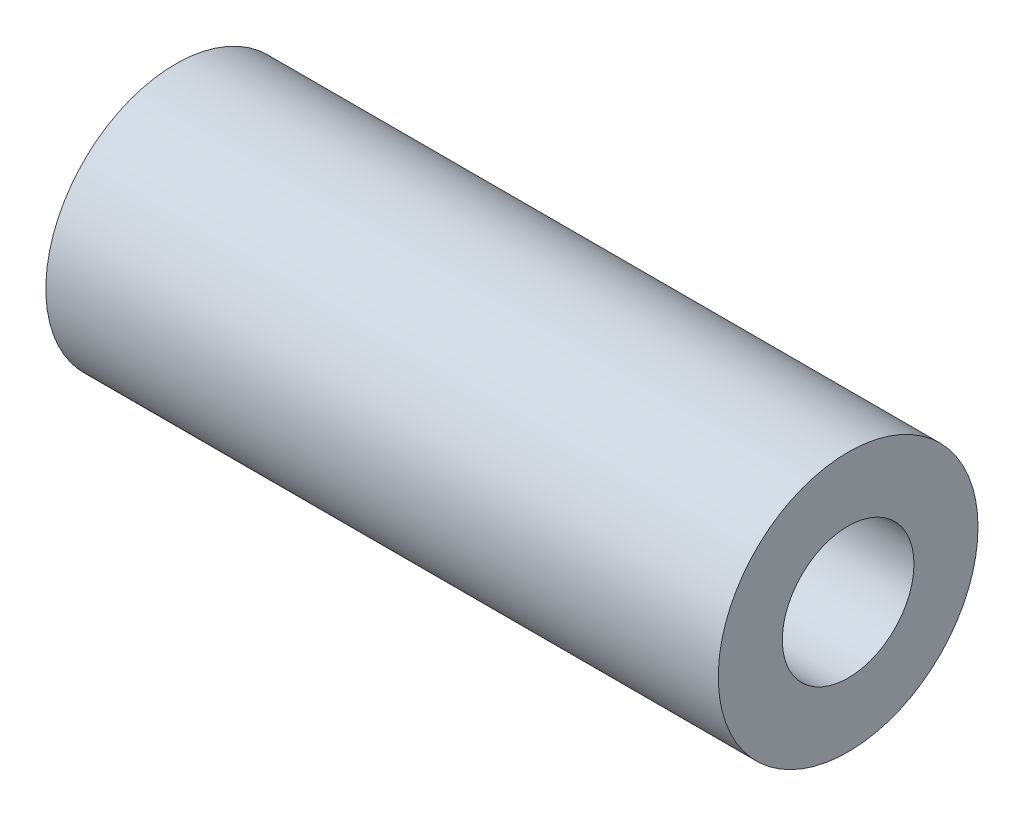
ISO-10303-21;
HEADER;
FILE_DESCRIPTION(('STEP AP214'),'2;1');
FILE_NAME('part.step','',(''),(''),'','','');
FILE_SCHEMA(('AUTOMOTIVE_DESIGN { 1 0 10303 214 1 1 1 1 }'));
ENDSEC;
DATA;
#1=APPLICATION_CONTEXT('core data for automotive mechanical design processes');
#2=APPLICATION_PROTOCOL_DEFINITION('international standard','automotive_design',2000,#1);
#3=PRODUCT_CONTEXT('',#1,'mechanical');
#4=PRODUCT('Part','Part','',(#3));
#5=PRODUCT_RELATED_PRODUCT_CATEGORY('part','',(#4));
#6=PRODUCT_DEFINITION_FORMATION('','',#4);
#7=PRODUCT_DEFINITION_CONTEXT('part definition',#1,'design');
#8=PRODUCT_DEFINITION('design','',#6,#7);
#9=PRODUCT_DEFINITION_SHAPE('','',#8);
#10=(LENGTH_UNIT() NAMED_UNIT(*) SI_UNIT(.MILLI.,.METRE.));
#11=(NAMED_UNIT(*) PLANE_ANGLE_UNIT() SI_UNIT($,.RADIAN.));
#12=(NAMED_UNIT(*) SI_UNIT($,.STERADIAN.) SOLID_ANGLE_UNIT());
#13=UNCERTAINTY_MEASURE_WITH_UNIT(LENGTH_MEASURE(1.E-05),#10,'distance_accuracy_value','');
#14=(GEOMETRIC_REPRESENTATION_CONTEXT(3) GLOBAL_UNCERTAINTY_ASSIGNED_CONTEXT((#13)) GLOBAL_UNIT_ASSIGNED_CONTEXT((#10,
#11,#12)) REPRESENTATION_CONTEXT('',''));
#15=CARTESIAN_POINT('',(0.,0.,0.));
#16=DIRECTION('',(0.,0.,1.));
#17=DIRECTION('',(1.,0.,0.));
#18=AXIS2_PLACEMENT_3D('',#15,#16,#17);
#19=CARTESIAN_POINT('',(33.3375,0.,0.));
#20=DIRECTION('',(1.,0.,0.));
#21=DIRECTION('',(0.,0.,-1.));
#22=AXIS2_PLACEMENT_3D('',#19,#20,#21);
#23=PLANE('',#22);
#24=CARTESIAN_POINT('',(33.3375,0.,0.));
#25=DIRECTION('',(1.,0.,0.));
#26=DIRECTION('',(0.,0.,-1.));
#27=AXIS2_PLACEMENT_3D('',#24,#25,#26);
#28=CIRCLE('',#27,6.4389);
#29=CARTESIAN_POINT('',(33.3375,0.,-6.4389));
#30=VERTEX_POINT('',#29);
#31=EDGE_CURVE('E10',#30,#30,#28,.T.);
#32=ORIENTED_EDGE('',*,*,#31,.T.);
#33=EDGE_LOOP('',(#32));
#34=FACE_BOUND('',#33,.T.);
#35=CARTESIAN_POINT('',(33.3375,0.,0.));
#36=DIRECTION('',(1.,0.,0.));
#37=DIRECTION('',(0.,0.,-1.));
#38=AXIS2_PLACEMENT_3D('',#35,#36,#37);
#39=CIRCLE('',#38,3.2639);
#40=CARTESIAN_POINT('',(33.3375,0.,-3.2639));
#41=VERTEX_POINT('',#40);
#42=EDGE_CURVE('E45',#41,#41,#39,.T.);
#43=ORIENTED_EDGE('',*,*,#42,.F.);
#44=EDGE_LOOP('',(#43));
#45=FACE_BOUND('',#44,.T.);
#46=ADVANCED_FACE('F34',(#34,#45),#23,.T.);
#47=CARTESIAN_POINT('',(0.,0.,0.));
#48=DIRECTION('',(1.,0.,0.));
#49=DIRECTION('',(0.,0.,-1.));
#50=AXIS2_PLACEMENT_3D('',#47,#48,#49);
#51=PLANE('',#50);
#52=CARTESIAN_POINT('',(0.,0.,0.));
#53=DIRECTION('',(1.,0.,0.));
#54=DIRECTION('',(0.,0.,-1.));
#55=AXIS2_PLACEMENT_3D('',#52,#53,#54);
#56=CIRCLE('',#55,6.4389);
#57=CARTESIAN_POINT('',(0.,0.,-6.4389));
#58=VERTEX_POINT('',#57);
#59=EDGE_CURVE('E38',#58,#58,#56,.T.);
#60=ORIENTED_EDGE('',*,*,#59,.F.);
#61=EDGE_LOOP('',(#60));
#62=FACE_BOUND('',#61,.T.);
#63=CARTESIAN_POINT('',(0.,0.,0.));
#64=DIRECTION('',(1.,0.,0.));
#65=DIRECTION('',(0.,0.,-1.));
#66=AXIS2_PLACEMENT_3D('',#63,#64,#65);
#67=CIRCLE('',#66,3.2639);
#68=CARTESIAN_POINT('',(0.,0.,-3.2639));
#69=VERTEX_POINT('',#68);
#70=EDGE_CURVE('E47',#69,#69,#67,.T.);
#71=ORIENTED_EDGE('',*,*,#70,.T.);
#72=EDGE_LOOP('',(#71));
#73=FACE_BOUND('',#72,.T.);
#74=ADVANCED_FACE('F57',(#62,#73),#51,.F.);
#75=CARTESIAN_POINT('',(33.3375,0.,0.));
#76=DIRECTION('',(-1.,0.,0.));
#77=DIRECTION('',(0.,0.,1.));
#78=AXIS2_PLACEMENT_3D('',#75,#76,#77);
#79=CYLINDRICAL_SURFACE('',#78,6.4389);
#80=ORIENTED_EDGE('',*,*,#31,.F.);
#81=EDGE_LOOP('',(#80));
#82=FACE_BOUND('',#81,.T.);
#83=ORIENTED_EDGE('',*,*,#59,.T.);
#84=EDGE_LOOP('',(#83));
#85=FACE_BOUND('',#84,.T.);
#86=ADVANCED_FACE('F36',(#82,#85),#79,.T.);
#87=CARTESIAN_POINT('',(33.3375,0.,0.));
#88=DIRECTION('',(-1.,0.,0.));
#89=DIRECTION('',(0.,0.,1.));
#90=AXIS2_PLACEMENT_3D('',#87,#88,#89);
#91=CYLINDRICAL_SURFACE('',#90,3.2639);
#92=ORIENTED_EDGE('',*,*,#42,.T.);
#93=EDGE_LOOP('',(#92));
#94=FACE_BOUND('',#93,.T.);
#95=ORIENTED_EDGE('',*,*,#70,.F.);
#96=EDGE_LOOP('',(#95));
#97=FACE_BOUND('',#96,.T.);
#98=ADVANCED_FACE('F53',(#94,#97),#91,.F.);
#99=CLOSED_SHELL('',(#46,#74,#86,#98));
#100=MANIFOLD_SOLID_BREP('B2',#99);
#101=ADVANCED_BREP_SHAPE_REPRESENTATION('',(#18,#100),#14);
#102=SHAPE_DEFINITION_REPRESENTATION(#9,#101);
ENDSEC;
END-ISO-10303-21;
